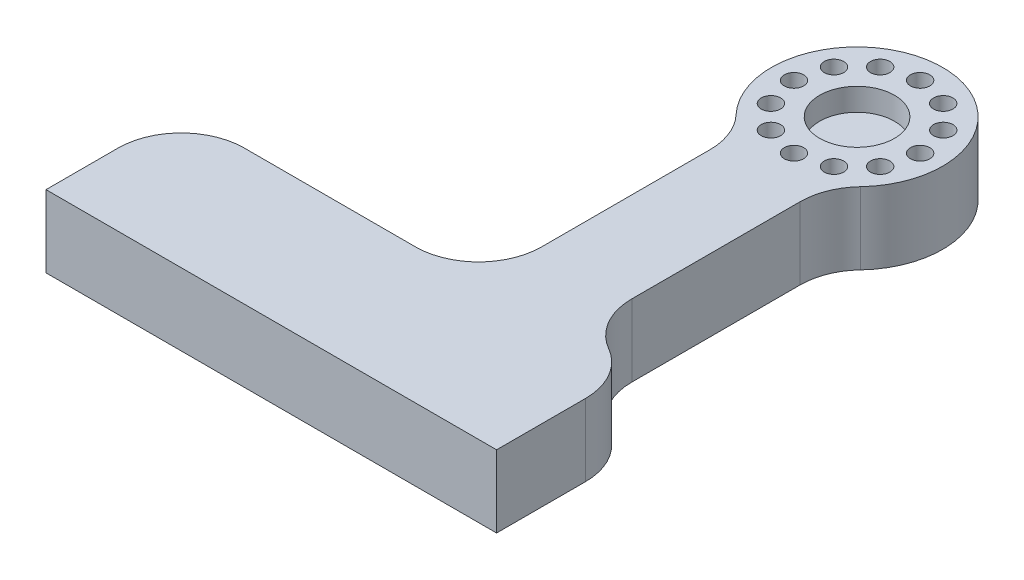
ISO-10303-21;
HEADER;
FILE_DESCRIPTION(('STEP AP214'),'2;1');
FILE_NAME('part.step','',(''),(''),'','','');
FILE_SCHEMA(('AUTOMOTIVE_DESIGN { 1 0 10303 214 1 1 1 1 }'));
ENDSEC;
DATA;
#1=APPLICATION_CONTEXT('core data for automotive mechanical design processes');
#2=APPLICATION_PROTOCOL_DEFINITION('international standard','automotive_design',2000,#1);
#3=PRODUCT_CONTEXT('',#1,'mechanical');
#4=PRODUCT('Part','Part','',(#3));
#5=PRODUCT_RELATED_PRODUCT_CATEGORY('part','',(#4));
#6=PRODUCT_DEFINITION_FORMATION('','',#4);
#7=PRODUCT_DEFINITION_CONTEXT('part definition',#1,'design');
#8=PRODUCT_DEFINITION('design','',#6,#7);
#9=PRODUCT_DEFINITION_SHAPE('','',#8);
#10=(LENGTH_UNIT() NAMED_UNIT(*) SI_UNIT(.MILLI.,.METRE.));
#11=(NAMED_UNIT(*) PLANE_ANGLE_UNIT() SI_UNIT($,.RADIAN.));
#12=(NAMED_UNIT(*) SI_UNIT($,.STERADIAN.) SOLID_ANGLE_UNIT());
#13=UNCERTAINTY_MEASURE_WITH_UNIT(LENGTH_MEASURE(1.E-05),#10,'distance_accuracy_value','');
#14=(GEOMETRIC_REPRESENTATION_CONTEXT(3) GLOBAL_UNCERTAINTY_ASSIGNED_CONTEXT((#13)) GLOBAL_UNIT_ASSIGNED_CONTEXT((#10,
#11,#12)) REPRESENTATION_CONTEXT('',''));
#15=CARTESIAN_POINT('',(0.,0.,0.));
#16=DIRECTION('',(0.,0.,1.));
#17=DIRECTION('',(1.,0.,0.));
#18=AXIS2_PLACEMENT_3D('',#15,#16,#17);
#19=CARTESIAN_POINT('',(5.,8.,0.));
#20=DIRECTION('',(1.,0.,0.));
#21=DIRECTION('',(0.,0.,-1.));
#22=AXIS2_PLACEMENT_3D('',#19,#20,#21);
#23=PLANE('',#22);
#24=DIRECTION('',(0.,0.,1.));
#25=VECTOR('',#24,1.);
#26=CARTESIAN_POINT('',(5.,0.,0.));
#27=LINE('',#26,#25);
#28=CARTESIAN_POINT('',(5.,0.,11.3247516529061));
#29=VERTEX_POINT('',#28);
#30=CARTESIAN_POINT('',(5.,0.,30.));
#31=VERTEX_POINT('',#30);
#32=EDGE_CURVE('E204',#29,#31,#27,.T.);
#33=ORIENTED_EDGE('',*,*,#32,.F.);
#34=DIRECTION('',(0.,-1.,0.));
#35=VECTOR('',#34,1.);
#36=CARTESIAN_POINT('',(5.,8.,11.3247516529061));
#37=LINE('',#36,#35);
#38=CARTESIAN_POINT('',(5.,8.,11.3247516529061));
#39=VERTEX_POINT('',#38);
#40=EDGE_CURVE('E281',#29,#39,#37,.F.);
#41=ORIENTED_EDGE('',*,*,#40,.T.);
#42=DIRECTION('',(0.,0.,1.));
#43=VECTOR('',#42,1.);
#44=CARTESIAN_POINT('',(5.,8.,0.));
#45=LINE('',#44,#43);
#46=CARTESIAN_POINT('',(5.,8.,30.));
#47=VERTEX_POINT('',#46);
#48=EDGE_CURVE('E331',#39,#47,#45,.T.);
#49=ORIENTED_EDGE('',*,*,#48,.T.);
#50=DIRECTION('',(0.,-1.,0.));
#51=VECTOR('',#50,1.);
#52=CARTESIAN_POINT('',(5.,0.,30.));
#53=LINE('',#52,#51);
#54=EDGE_CURVE('E146',#47,#31,#53,.T.);
#55=ORIENTED_EDGE('',*,*,#54,.T.);
#56=EDGE_LOOP('',(#33,#41,#49,#55));
#57=FACE_BOUND('',#56,.T.);
#58=ADVANCED_FACE('F42',(#57),#23,.T.);
#59=CARTESIAN_POINT('',(0.,8.,0.));
#60=DIRECTION('',(0.,-1.,0.));
#61=DIRECTION('',(0.,0.,-1.));
#62=AXIS2_PLACEMENT_3D('',#59,#60,#61);
#63=CYLINDRICAL_SURFACE('',#62,9.5);
#64=CARTESIAN_POINT('',(0.,0.,0.));
#65=DIRECTION('',(0.,1.,0.));
#66=DIRECTION('',(0.,0.,1.));
#67=AXIS2_PLACEMENT_3D('',#64,#65,#66);
#68=CIRCLE('',#67,9.5);
#69=CARTESIAN_POINT('',(6.90909090909091,0.,6.52031155773383));
#70=VERTEX_POINT('',#69);
#71=CARTESIAN_POINT('',(-6.90909090909091,0.,6.52031155773383));
#72=VERTEX_POINT('',#71);
#73=EDGE_CURVE('E207',#70,#72,#68,.T.);
#74=ORIENTED_EDGE('',*,*,#73,.T.);
#75=DIRECTION('',(0.,-1.,0.));
#76=VECTOR('',#75,1.);
#77=CARTESIAN_POINT('',(-6.90909090909091,8.,6.52031155773383));
#78=LINE('',#77,#76);
#79=CARTESIAN_POINT('',(-6.90909090909091,8.,6.52031155773383));
#80=VERTEX_POINT('',#79);
#81=EDGE_CURVE('E279',#72,#80,#78,.F.);
#82=ORIENTED_EDGE('',*,*,#81,.T.);
#83=CARTESIAN_POINT('',(0.,8.,0.));
#84=DIRECTION('',(0.,1.,0.));
#85=DIRECTION('',(0.,0.,1.));
#86=AXIS2_PLACEMENT_3D('',#83,#84,#85);
#87=CIRCLE('',#86,9.5);
#88=CARTESIAN_POINT('',(6.90909090909091,8.,6.52031155773383));
#89=VERTEX_POINT('',#88);
#90=EDGE_CURVE('E329',#89,#80,#87,.T.);
#91=ORIENTED_EDGE('',*,*,#90,.F.);
#92=DIRECTION('',(0.,-1.,0.));
#93=VECTOR('',#92,1.);
#94=CARTESIAN_POINT('',(6.90909090909091,8.,6.52031155773383));
#95=LINE('',#94,#93);
#96=EDGE_CURVE('E276',#89,#70,#95,.T.);
#97=ORIENTED_EDGE('',*,*,#96,.T.);
#98=EDGE_LOOP('',(#74,#82,#91,#97));
#99=FACE_BOUND('',#98,.T.);
#100=ADVANCED_FACE('F333',(#99),#63,.T.);
#101=CARTESIAN_POINT('',(-5.,8.,0.));
#102=DIRECTION('',(-1.,0.,0.));
#103=DIRECTION('',(0.,0.,1.));
#104=AXIS2_PLACEMENT_3D('',#101,#102,#103);
#105=PLANE('',#104);
#106=DIRECTION('',(0.,0.,-1.));
#107=VECTOR('',#106,1.);
#108=CARTESIAN_POINT('',(-5.,8.,0.));
#109=LINE('',#108,#107);
#110=CARTESIAN_POINT('',(-5.,8.,30.));
#111=VERTEX_POINT('',#110);
#112=CARTESIAN_POINT('',(-5.,8.,11.3247516529061));
#113=VERTEX_POINT('',#112);
#114=EDGE_CURVE('E163',#111,#113,#109,.T.);
#115=ORIENTED_EDGE('',*,*,#114,.T.);
#116=DIRECTION('',(0.,-1.,0.));
#117=VECTOR('',#116,1.);
#118=CARTESIAN_POINT('',(-5.,8.,11.3247516529061));
#119=LINE('',#118,#117);
#120=CARTESIAN_POINT('',(-5.,0.,11.3247516529061));
#121=VERTEX_POINT('',#120);
#122=EDGE_CURVE('E273',#113,#121,#119,.T.);
#123=ORIENTED_EDGE('',*,*,#122,.T.);
#124=DIRECTION('',(0.,0.,-1.));
#125=VECTOR('',#124,1.);
#126=CARTESIAN_POINT('',(-5.,0.,0.));
#127=LINE('',#126,#125);
#128=CARTESIAN_POINT('',(-5.,0.,30.));
#129=VERTEX_POINT('',#128);
#130=EDGE_CURVE('E210',#129,#121,#127,.T.);
#131=ORIENTED_EDGE('',*,*,#130,.F.);
#132=DIRECTION('',(0.,-1.,0.));
#133=VECTOR('',#132,1.);
#134=CARTESIAN_POINT('',(-5.,8.,30.));
#135=LINE('',#134,#133);
#136=EDGE_CURVE('E266',#129,#111,#135,.F.);
#137=ORIENTED_EDGE('',*,*,#136,.T.);
#138=EDGE_LOOP('',(#115,#123,#131,#137));
#139=FACE_BOUND('',#138,.T.);
#140=ADVANCED_FACE('F378',(#139),#105,.T.);
#141=CARTESIAN_POINT('',(0.,8.,37.));
#142=DIRECTION('',(0.,0.,-1.));
#143=DIRECTION('',(-1.,0.,0.));
#144=AXIS2_PLACEMENT_3D('',#141,#142,#143);
#145=PLANE('',#144);
#146=DIRECTION('',(1.,0.,0.));
#147=VECTOR('',#146,1.);
#148=CARTESIAN_POINT('',(0.,0.,37.));
#149=LINE('',#148,#147);
#150=CARTESIAN_POINT('',(-31.,0.,37.));
#151=VERTEX_POINT('',#150);
#152=CARTESIAN_POINT('',(-12.,0.,37.));
#153=VERTEX_POINT('',#152);
#154=EDGE_CURVE('E213',#151,#153,#149,.T.);
#155=ORIENTED_EDGE('',*,*,#154,.F.);
#156=DIRECTION('',(0.,-1.,0.));
#157=VECTOR('',#156,1.);
#158=CARTESIAN_POINT('',(-31.,8.,37.));
#159=LINE('',#158,#157);
#160=CARTESIAN_POINT('',(-31.,8.,37.));
#161=VERTEX_POINT('',#160);
#162=EDGE_CURVE('E50',#151,#161,#159,.F.);
#163=ORIENTED_EDGE('',*,*,#162,.T.);
#164=DIRECTION('',(1.,0.,0.));
#165=VECTOR('',#164,1.);
#166=CARTESIAN_POINT('',(0.,8.,37.));
#167=LINE('',#166,#165);
#168=CARTESIAN_POINT('',(-12.,8.,37.));
#169=VERTEX_POINT('',#168);
#170=EDGE_CURVE('E161',#161,#169,#167,.T.);
#171=ORIENTED_EDGE('',*,*,#170,.T.);
#172=DIRECTION('',(0.,-1.,0.));
#173=VECTOR('',#172,1.);
#174=CARTESIAN_POINT('',(-12.,0.,37.));
#175=LINE('',#174,#173);
#176=EDGE_CURVE('E263',#169,#153,#175,.T.);
#177=ORIENTED_EDGE('',*,*,#176,.T.);
#178=EDGE_LOOP('',(#155,#163,#171,#177));
#179=FACE_BOUND('',#178,.T.);
#180=ADVANCED_FACE('F425',(#179),#145,.T.);
#181=CARTESIAN_POINT('',(-38.,8.,0.));
#182=DIRECTION('',(-1.,0.,0.));
#183=DIRECTION('',(0.,0.,1.));
#184=AXIS2_PLACEMENT_3D('',#181,#182,#183);
#185=PLANE('',#184);
#186=DIRECTION('',(0.,0.,-1.));
#187=VECTOR('',#186,1.);
#188=CARTESIAN_POINT('',(-38.,8.,0.));
#189=LINE('',#188,#187);
#190=CARTESIAN_POINT('',(-38.,8.,52.));
#191=VERTEX_POINT('',#190);
#192=CARTESIAN_POINT('',(-38.,8.,44.));
#193=VERTEX_POINT('',#192);
#194=EDGE_CURVE('E140',#191,#193,#189,.T.);
#195=ORIENTED_EDGE('',*,*,#194,.T.);
#196=DIRECTION('',(0.,-1.,0.));
#197=VECTOR('',#196,1.);
#198=CARTESIAN_POINT('',(-38.,8.,44.));
#199=LINE('',#198,#197);
#200=CARTESIAN_POINT('',(-38.,0.,44.));
#201=VERTEX_POINT('',#200);
#202=EDGE_CURVE('E300',#193,#201,#199,.T.);
#203=ORIENTED_EDGE('',*,*,#202,.T.);
#204=DIRECTION('',(0.,0.,-1.));
#205=VECTOR('',#204,1.);
#206=CARTESIAN_POINT('',(-38.,0.,0.));
#207=LINE('',#206,#205);
#208=CARTESIAN_POINT('',(-38.,0.,52.));
#209=VERTEX_POINT('',#208);
#210=EDGE_CURVE('E142',#209,#201,#207,.T.);
#211=ORIENTED_EDGE('',*,*,#210,.F.);
#212=DIRECTION('',(0.,-1.,0.));
#213=VECTOR('',#212,1.);
#214=CARTESIAN_POINT('',(-38.,8.,52.));
#215=LINE('',#214,#213);
#216=EDGE_CURVE('E135',#191,#209,#215,.T.);
#217=ORIENTED_EDGE('',*,*,#216,.F.);
#218=EDGE_LOOP('',(#195,#203,#211,#217));
#219=FACE_BOUND('',#218,.T.);
#220=ADVANCED_FACE('F137',(#219),#185,.T.);
#221=CARTESIAN_POINT('',(0.,8.,52.));
#222=DIRECTION('',(0.,0.,-1.));
#223=DIRECTION('',(-1.,0.,0.));
#224=AXIS2_PLACEMENT_3D('',#221,#222,#223);
#225=PLANE('',#224);
#226=DIRECTION('',(1.,0.,0.));
#227=VECTOR('',#226,1.);
#228=CARTESIAN_POINT('',(0.,0.,52.));
#229=LINE('',#228,#227);
#230=CARTESIAN_POINT('',(12.,0.,52.));
#231=VERTEX_POINT('',#230);
#232=EDGE_CURVE('E216',#209,#231,#229,.T.);
#233=ORIENTED_EDGE('',*,*,#232,.T.);
#234=DIRECTION('',(0.,-1.,0.));
#235=VECTOR('',#234,1.);
#236=CARTESIAN_POINT('',(12.,8.,52.));
#237=LINE('',#236,#235);
#238=CARTESIAN_POINT('',(12.,8.,52.));
#239=VERTEX_POINT('',#238);
#240=EDGE_CURVE('E147',#239,#231,#237,.T.);
#241=ORIENTED_EDGE('',*,*,#240,.F.);
#242=DIRECTION('',(1.,0.,0.));
#243=VECTOR('',#242,1.);
#244=CARTESIAN_POINT('',(0.,8.,52.));
#245=LINE('',#244,#243);
#246=EDGE_CURVE('E151',#191,#239,#245,.T.);
#247=ORIENTED_EDGE('',*,*,#246,.F.);
#248=ORIENTED_EDGE('',*,*,#216,.T.);
#249=EDGE_LOOP('',(#233,#241,#247,#248));
#250=FACE_BOUND('',#249,.T.);
#251=ADVANCED_FACE('F152',(#250),#225,.F.);
#252=CARTESIAN_POINT('',(12.,8.,0.));
#253=DIRECTION('',(-1.,0.,0.));
#254=DIRECTION('',(0.,0.,1.));
#255=AXIS2_PLACEMENT_3D('',#252,#253,#254);
#256=PLANE('',#255);
#257=DIRECTION('',(0.,0.,-1.));
#258=VECTOR('',#257,1.);
#259=CARTESIAN_POINT('',(12.,0.,0.));
#260=LINE('',#259,#258);
#261=CARTESIAN_POINT('',(12.,0.,42.1243556529821));
#262=VERTEX_POINT('',#261);
#263=EDGE_CURVE('E218',#231,#262,#260,.T.);
#264=ORIENTED_EDGE('',*,*,#263,.T.);
#265=DIRECTION('',(0.,1.,0.));
#266=VECTOR('',#265,1.);
#267=CARTESIAN_POINT('',(12.,8.,42.1243556529821));
#268=LINE('',#267,#266);
#269=CARTESIAN_POINT('',(12.,8.,42.1243556529821));
#270=VERTEX_POINT('',#269);
#271=EDGE_CURVE('E296',#262,#270,#268,.T.);
#272=ORIENTED_EDGE('',*,*,#271,.T.);
#273=DIRECTION('',(0.,0.,-1.));
#274=VECTOR('',#273,1.);
#275=CARTESIAN_POINT('',(12.,8.,0.));
#276=LINE('',#275,#274);
#277=EDGE_CURVE('E156',#239,#270,#276,.T.);
#278=ORIENTED_EDGE('',*,*,#277,.F.);
#279=ORIENTED_EDGE('',*,*,#240,.T.);
#280=EDGE_LOOP('',(#264,#272,#278,#279));
#281=FACE_BOUND('',#280,.T.);
#282=ADVANCED_FACE('F307',(#281),#256,.F.);
#283=CARTESIAN_POINT('',(3.50000000000004,8.,-6.0621778264912));
#284=DIRECTION('',(0.,-1.,0.));
#285=DIRECTION('',(0.,0.,-1.));
#286=AXIS2_PLACEMENT_3D('',#283,#284,#285);
#287=CYLINDRICAL_SURFACE('',#286,1.075);
#288=CARTESIAN_POINT('',(3.50000000000004,8.,-6.0621778264912));
#289=DIRECTION('',(0.,1.,0.));
#290=DIRECTION('',(0.,0.,1.));
#291=AXIS2_PLACEMENT_3D('',#288,#289,#290);
#292=CIRCLE('',#291,1.075);
#293=CARTESIAN_POINT('',(3.50000000000004,8.,-4.9871778264912));
#294=VERTEX_POINT('',#293);
#295=EDGE_CURVE('E195',#294,#294,#292,.T.);
#296=ORIENTED_EDGE('',*,*,#295,.T.);
#297=EDGE_LOOP('',(#296));
#298=FACE_BOUND('',#297,.T.);
#299=CARTESIAN_POINT('',(3.50000000000004,0.,-6.0621778264912));
#300=DIRECTION('',(0.,1.,0.));
#301=DIRECTION('',(0.,0.,1.));
#302=AXIS2_PLACEMENT_3D('',#299,#300,#301);
#303=CIRCLE('',#302,1.075);
#304=CARTESIAN_POINT('',(3.50000000000004,0.,-4.9871778264912));
#305=VERTEX_POINT('',#304);
#306=EDGE_CURVE('E248',#305,#305,#303,.T.);
#307=ORIENTED_EDGE('',*,*,#306,.F.);
#308=EDGE_LOOP('',(#307));
#309=FACE_BOUND('',#308,.T.);
#310=ADVANCED_FACE('F463',(#298,#309),#287,.F.);
#311=CARTESIAN_POINT('',(6.0621778264912,8.,-3.50000000000022));
#312=DIRECTION('',(0.,-1.,0.));
#313=DIRECTION('',(0.,0.,-1.));
#314=AXIS2_PLACEMENT_3D('',#311,#312,#313);
#315=CYLINDRICAL_SURFACE('',#314,1.075);
#316=CARTESIAN_POINT('',(6.0621778264912,8.,-3.50000000000022));
#317=DIRECTION('',(0.,1.,0.));
#318=DIRECTION('',(0.,0.,1.));
#319=AXIS2_PLACEMENT_3D('',#316,#317,#318);
#320=CIRCLE('',#319,1.075);
#321=CARTESIAN_POINT('',(6.0621778264912,8.,-2.42500000000022));
#322=VERTEX_POINT('',#321);
#323=EDGE_CURVE('E192',#322,#322,#320,.T.);
#324=ORIENTED_EDGE('',*,*,#323,.T.);
#325=EDGE_LOOP('',(#324));
#326=FACE_BOUND('',#325,.T.);
#327=CARTESIAN_POINT('',(6.0621778264912,0.,-3.50000000000022));
#328=DIRECTION('',(0.,1.,0.));
#329=DIRECTION('',(0.,0.,1.));
#330=AXIS2_PLACEMENT_3D('',#327,#328,#329);
#331=CIRCLE('',#330,1.075);
#332=CARTESIAN_POINT('',(6.0621778264912,0.,-2.42500000000022));
#333=VERTEX_POINT('',#332);
#334=EDGE_CURVE('E245',#333,#333,#331,.T.);
#335=ORIENTED_EDGE('',*,*,#334,.F.);
#336=EDGE_LOOP('',(#335));
#337=FACE_BOUND('',#336,.T.);
#338=ADVANCED_FACE('F619',(#326,#337),#315,.F.);
#339=CARTESIAN_POINT('',(7.00000000000025,8.,-2.54754435094361E-13));
#340=DIRECTION('',(0.,-1.,0.));
#341=DIRECTION('',(0.,0.,-1.));
#342=AXIS2_PLACEMENT_3D('',#339,#340,#341);
#343=CYLINDRICAL_SURFACE('',#342,1.075);
#344=CARTESIAN_POINT('',(7.00000000000025,8.,-2.54754435094361E-13));
#345=DIRECTION('',(0.,1.,0.));
#346=DIRECTION('',(0.,0.,1.));
#347=AXIS2_PLACEMENT_3D('',#344,#345,#346);
#348=CIRCLE('',#347,1.075);
#349=CARTESIAN_POINT('',(7.00000000000025,8.,1.07499999999974));
#350=VERTEX_POINT('',#349);
#351=EDGE_CURVE('E189',#350,#350,#348,.T.);
#352=ORIENTED_EDGE('',*,*,#351,.T.);
#353=EDGE_LOOP('',(#352));
#354=FACE_BOUND('',#353,.T.);
#355=CARTESIAN_POINT('',(7.00000000000025,0.,-2.54754435094361E-13));
#356=DIRECTION('',(0.,1.,0.));
#357=DIRECTION('',(0.,0.,1.));
#358=AXIS2_PLACEMENT_3D('',#355,#356,#357);
#359=CIRCLE('',#358,1.075);
#360=CARTESIAN_POINT('',(7.00000000000025,0.,1.07499999999974));
#361=VERTEX_POINT('',#360);
#362=EDGE_CURVE('E242',#361,#361,#359,.T.);
#363=ORIENTED_EDGE('',*,*,#362,.F.);
#364=EDGE_LOOP('',(#363));
#365=FACE_BOUND('',#364,.T.);
#366=ADVANCED_FACE('F608',(#354,#365),#343,.F.);
#367=CARTESIAN_POINT('',(-6.99999999999975,8.,2.55611687853764E-13));
#368=DIRECTION('',(0.,-1.,0.));
#369=DIRECTION('',(0.,0.,-1.));
#370=AXIS2_PLACEMENT_3D('',#367,#368,#369);
#371=CYLINDRICAL_SURFACE('',#370,1.075);
#372=CARTESIAN_POINT('',(-6.99999999999975,8.,2.55611687853764E-13));
#373=DIRECTION('',(0.,1.,0.));
#374=DIRECTION('',(0.,0.,1.));
#375=AXIS2_PLACEMENT_3D('',#372,#373,#374);
#376=CIRCLE('',#375,1.075);
#377=CARTESIAN_POINT('',(-6.99999999999975,8.,1.07500000000026));
#378=VERTEX_POINT('',#377);
#379=EDGE_CURVE('E186',#378,#378,#376,.T.);
#380=ORIENTED_EDGE('',*,*,#379,.T.);
#381=EDGE_LOOP('',(#380));
#382=FACE_BOUND('',#381,.T.);
#383=CARTESIAN_POINT('',(-6.99999999999975,0.,2.55611687853764E-13));
#384=DIRECTION('',(0.,1.,0.));
#385=DIRECTION('',(0.,0.,1.));
#386=AXIS2_PLACEMENT_3D('',#383,#384,#385);
#387=CIRCLE('',#386,1.075);
#388=CARTESIAN_POINT('',(-6.99999999999975,0.,1.07500000000026));
#389=VERTEX_POINT('',#388);
#390=EDGE_CURVE('E239',#389,#389,#387,.T.);
#391=ORIENTED_EDGE('',*,*,#390,.F.);
#392=EDGE_LOOP('',(#391));
#393=FACE_BOUND('',#392,.T.);
#394=ADVANCED_FACE('F597',(#382,#393),#371,.F.);
#395=CARTESIAN_POINT('',(-6.06217782649095,8.,-3.49999999999978));
#396=DIRECTION('',(0.,-1.,0.));
#397=DIRECTION('',(0.,0.,-1.));
#398=AXIS2_PLACEMENT_3D('',#395,#396,#397);
#399=CYLINDRICAL_SURFACE('',#398,1.075);
#400=CARTESIAN_POINT('',(-6.06217782649095,8.,-3.49999999999978));
#401=DIRECTION('',(0.,1.,0.));
#402=DIRECTION('',(0.,0.,1.));
#403=AXIS2_PLACEMENT_3D('',#400,#401,#402);
#404=CIRCLE('',#403,1.075);
#405=CARTESIAN_POINT('',(-6.06217782649095,8.,-2.42499999999977));
#406=VERTEX_POINT('',#405);
#407=EDGE_CURVE('E183',#406,#406,#404,.T.);
#408=ORIENTED_EDGE('',*,*,#407,.T.);
#409=EDGE_LOOP('',(#408));
#410=FACE_BOUND('',#409,.T.);
#411=CARTESIAN_POINT('',(-6.06217782649095,0.,-3.49999999999978));
#412=DIRECTION('',(0.,1.,0.));
#413=DIRECTION('',(0.,0.,1.));
#414=AXIS2_PLACEMENT_3D('',#411,#412,#413);
#415=CIRCLE('',#414,1.075);
#416=CARTESIAN_POINT('',(-6.06217782649095,0.,-2.42499999999977));
#417=VERTEX_POINT('',#416);
#418=EDGE_CURVE('E236',#417,#417,#415,.T.);
#419=ORIENTED_EDGE('',*,*,#418,.F.);
#420=EDGE_LOOP('',(#419));
#421=FACE_BOUND('',#420,.T.);
#422=ADVANCED_FACE('F586',(#410,#421),#399,.F.);
#423=CARTESIAN_POINT('',(-3.49999999999997,8.,-6.06217782649094));
#424=DIRECTION('',(0.,-1.,0.));
#425=DIRECTION('',(0.,0.,-1.));
#426=AXIS2_PLACEMENT_3D('',#423,#424,#425);
#427=CYLINDRICAL_SURFACE('',#426,1.075);
#428=CARTESIAN_POINT('',(-3.49999999999997,8.,-6.06217782649094));
#429=DIRECTION('',(0.,1.,0.));
#430=DIRECTION('',(0.,0.,1.));
#431=AXIS2_PLACEMENT_3D('',#428,#429,#430);
#432=CIRCLE('',#431,1.075);
#433=CARTESIAN_POINT('',(-3.49999999999997,8.,-4.98717782649094));
#434=VERTEX_POINT('',#433);
#435=EDGE_CURVE('E180',#434,#434,#432,.T.);
#436=ORIENTED_EDGE('',*,*,#435,.T.);
#437=EDGE_LOOP('',(#436));
#438=FACE_BOUND('',#437,.T.);
#439=CARTESIAN_POINT('',(-3.49999999999997,0.,-6.06217782649094));
#440=DIRECTION('',(0.,1.,0.));
#441=DIRECTION('',(0.,0.,1.));
#442=AXIS2_PLACEMENT_3D('',#439,#440,#441);
#443=CIRCLE('',#442,1.075);
#444=CARTESIAN_POINT('',(-3.49999999999997,0.,-4.98717782649094));
#445=VERTEX_POINT('',#444);
#446=EDGE_CURVE('E233',#445,#445,#443,.T.);
#447=ORIENTED_EDGE('',*,*,#446,.F.);
#448=EDGE_LOOP('',(#447));
#449=FACE_BOUND('',#448,.T.);
#450=ADVANCED_FACE('F575',(#438,#449),#427,.F.);
#451=CARTESIAN_POINT('',(3.50000000000048,8.,6.06217782649094));
#452=DIRECTION('',(0.,-1.,0.));
#453=DIRECTION('',(0.,0.,-1.));
#454=AXIS2_PLACEMENT_3D('',#451,#452,#453);
#455=CYLINDRICAL_SURFACE('',#454,1.075);
#456=CARTESIAN_POINT('',(3.50000000000048,8.,6.06217782649094));
#457=DIRECTION('',(0.,1.,0.));
#458=DIRECTION('',(0.,0.,1.));
#459=AXIS2_PLACEMENT_3D('',#456,#457,#458);
#460=CIRCLE('',#459,1.075);
#461=CARTESIAN_POINT('',(3.50000000000048,8.,7.13717782649094));
#462=VERTEX_POINT('',#461);
#463=EDGE_CURVE('E177',#462,#462,#460,.T.);
#464=ORIENTED_EDGE('',*,*,#463,.T.);
#465=EDGE_LOOP('',(#464));
#466=FACE_BOUND('',#465,.T.);
#467=CARTESIAN_POINT('',(3.50000000000048,0.,6.06217782649094));
#468=DIRECTION('',(0.,1.,0.));
#469=DIRECTION('',(0.,0.,1.));
#470=AXIS2_PLACEMENT_3D('',#467,#468,#469);
#471=CIRCLE('',#470,1.075);
#472=CARTESIAN_POINT('',(3.50000000000048,0.,7.13717782649094));
#473=VERTEX_POINT('',#472);
#474=EDGE_CURVE('E230',#473,#473,#471,.T.);
#475=ORIENTED_EDGE('',*,*,#474,.F.);
#476=EDGE_LOOP('',(#475));
#477=FACE_BOUND('',#476,.T.);
#478=ADVANCED_FACE('F564',(#466,#477),#455,.F.);
#479=CARTESIAN_POINT('',(5.09508870188722E-13,8.,7.));
#480=DIRECTION('',(0.,-1.,0.));
#481=DIRECTION('',(0.,0.,-1.));
#482=AXIS2_PLACEMENT_3D('',#479,#480,#481);
#483=CYLINDRICAL_SURFACE('',#482,1.075);
#484=CARTESIAN_POINT('',(5.09508870188722E-13,8.,7.));
#485=DIRECTION('',(0.,1.,0.));
#486=DIRECTION('',(0.,0.,1.));
#487=AXIS2_PLACEMENT_3D('',#484,#485,#486);
#488=CIRCLE('',#487,1.075);
#489=CARTESIAN_POINT('',(5.09508870188722E-13,8.,8.075));
#490=VERTEX_POINT('',#489);
#491=EDGE_CURVE('E174',#490,#490,#488,.T.);
#492=ORIENTED_EDGE('',*,*,#491,.T.);
#493=EDGE_LOOP('',(#492));
#494=FACE_BOUND('',#493,.T.);
#495=CARTESIAN_POINT('',(5.09508870188722E-13,0.,7.));
#496=DIRECTION('',(0.,1.,0.));
#497=DIRECTION('',(0.,0.,1.));
#498=AXIS2_PLACEMENT_3D('',#495,#496,#497);
#499=CIRCLE('',#498,1.075);
#500=CARTESIAN_POINT('',(5.09508870188722E-13,0.,8.075));
#501=VERTEX_POINT('',#500);
#502=EDGE_CURVE('E227',#501,#501,#499,.T.);
#503=ORIENTED_EDGE('',*,*,#502,.F.);
#504=EDGE_LOOP('',(#503));
#505=FACE_BOUND('',#504,.T.);
#506=ADVANCED_FACE('F553',(#494,#505),#483,.F.);
#507=CARTESIAN_POINT('',(-3.49999999999952,8.,6.0621778264912));
#508=DIRECTION('',(0.,-1.,0.));
#509=DIRECTION('',(0.,0.,-1.));
#510=AXIS2_PLACEMENT_3D('',#507,#508,#509);
#511=CYLINDRICAL_SURFACE('',#510,1.075);
#512=CARTESIAN_POINT('',(-3.49999999999952,8.,6.0621778264912));
#513=DIRECTION('',(0.,1.,0.));
#514=DIRECTION('',(0.,0.,1.));
#515=AXIS2_PLACEMENT_3D('',#512,#513,#514);
#516=CIRCLE('',#515,1.075);
#517=CARTESIAN_POINT('',(-3.49999999999952,8.,7.1371778264912));
#518=VERTEX_POINT('',#517);
#519=EDGE_CURVE('E171',#518,#518,#516,.T.);
#520=ORIENTED_EDGE('',*,*,#519,.T.);
#521=EDGE_LOOP('',(#520));
#522=FACE_BOUND('',#521,.T.);
#523=CARTESIAN_POINT('',(-3.49999999999952,0.,6.0621778264912));
#524=DIRECTION('',(0.,1.,0.));
#525=DIRECTION('',(0.,0.,1.));
#526=AXIS2_PLACEMENT_3D('',#523,#524,#525);
#527=CIRCLE('',#526,1.075);
#528=CARTESIAN_POINT('',(-3.49999999999952,0.,7.1371778264912));
#529=VERTEX_POINT('',#528);
#530=EDGE_CURVE('E224',#529,#529,#527,.T.);
#531=ORIENTED_EDGE('',*,*,#530,.F.);
#532=EDGE_LOOP('',(#531));
#533=FACE_BOUND('',#532,.T.);
#534=ADVANCED_FACE('F542',(#522,#533),#511,.F.);
#535=CARTESIAN_POINT('',(6.06217782649145,8.,3.49999999999978));
#536=DIRECTION('',(0.,-1.,0.));
#537=DIRECTION('',(0.,0.,-1.));
#538=AXIS2_PLACEMENT_3D('',#535,#536,#537);
#539=CYLINDRICAL_SURFACE('',#538,1.075);
#540=CARTESIAN_POINT('',(6.06217782649145,8.,3.49999999999978));
#541=DIRECTION('',(0.,1.,0.));
#542=DIRECTION('',(0.,0.,1.));
#543=AXIS2_PLACEMENT_3D('',#540,#541,#542);
#544=CIRCLE('',#543,1.075);
#545=CARTESIAN_POINT('',(6.06217782649145,8.,4.57499999999978));
#546=VERTEX_POINT('',#545);
#547=EDGE_CURVE('E168',#546,#546,#544,.T.);
#548=ORIENTED_EDGE('',*,*,#547,.T.);
#549=EDGE_LOOP('',(#548));
#550=FACE_BOUND('',#549,.T.);
#551=CARTESIAN_POINT('',(6.06217782649145,0.,3.49999999999978));
#552=DIRECTION('',(0.,1.,0.));
#553=DIRECTION('',(0.,0.,1.));
#554=AXIS2_PLACEMENT_3D('',#551,#552,#553);
#555=CIRCLE('',#554,1.075);
#556=CARTESIAN_POINT('',(6.06217782649145,0.,4.57499999999978));
#557=VERTEX_POINT('',#556);
#558=EDGE_CURVE('E221',#557,#557,#555,.T.);
#559=ORIENTED_EDGE('',*,*,#558,.F.);
#560=EDGE_LOOP('',(#559));
#561=FACE_BOUND('',#560,.T.);
#562=ADVANCED_FACE('F364',(#550,#561),#539,.F.);
#563=CARTESIAN_POINT('',(-6.06217782649069,8.,3.50000000000022));
#564=DIRECTION('',(0.,-1.,0.));
#565=DIRECTION('',(0.,0.,-1.));
#566=AXIS2_PLACEMENT_3D('',#563,#564,#565);
#567=CYLINDRICAL_SURFACE('',#566,1.075);
#568=CARTESIAN_POINT('',(-6.06217782649069,8.,3.50000000000022));
#569=DIRECTION('',(0.,1.,0.));
#570=DIRECTION('',(0.,0.,1.));
#571=AXIS2_PLACEMENT_3D('',#568,#569,#570);
#572=CIRCLE('',#571,1.075);
#573=CARTESIAN_POINT('',(-6.06217782649069,8.,4.57500000000022));
#574=VERTEX_POINT('',#573);
#575=EDGE_CURVE('E254',#574,#574,#572,.T.);
#576=ORIENTED_EDGE('',*,*,#575,.T.);
#577=EDGE_LOOP('',(#576));
#578=FACE_BOUND('',#577,.T.);
#579=CARTESIAN_POINT('',(-6.06217782649069,0.,3.50000000000022));
#580=DIRECTION('',(0.,1.,0.));
#581=DIRECTION('',(0.,0.,1.));
#582=AXIS2_PLACEMENT_3D('',#579,#580,#581);
#583=CIRCLE('',#582,1.075);
#584=CARTESIAN_POINT('',(-6.06217782649069,0.,4.57500000000022));
#585=VERTEX_POINT('',#584);
#586=EDGE_CURVE('E201',#585,#585,#583,.T.);
#587=ORIENTED_EDGE('',*,*,#586,.F.);
#588=EDGE_LOOP('',(#587));
#589=FACE_BOUND('',#588,.T.);
#590=ADVANCED_FACE('F361',(#578,#589),#567,.F.);
#591=CARTESIAN_POINT('',(0.,8.,-7.));
#592=DIRECTION('',(0.,-1.,0.));
#593=DIRECTION('',(0.,0.,-1.));
#594=AXIS2_PLACEMENT_3D('',#591,#592,#593);
#595=CYLINDRICAL_SURFACE('',#594,1.075);
#596=CARTESIAN_POINT('',(0.,8.,-7.));
#597=DIRECTION('',(0.,1.,0.));
#598=DIRECTION('',(0.,0.,1.));
#599=AXIS2_PLACEMENT_3D('',#596,#597,#598);
#600=CIRCLE('',#599,1.075);
#601=CARTESIAN_POINT('',(0.,8.,-5.925));
#602=VERTEX_POINT('',#601);
#603=EDGE_CURVE('E198',#602,#602,#600,.T.);
#604=ORIENTED_EDGE('',*,*,#603,.T.);
#605=EDGE_LOOP('',(#604));
#606=FACE_BOUND('',#605,.T.);
#607=CARTESIAN_POINT('',(0.,0.,-7.));
#608=DIRECTION('',(0.,1.,0.));
#609=DIRECTION('',(0.,0.,1.));
#610=AXIS2_PLACEMENT_3D('',#607,#608,#609);
#611=CIRCLE('',#610,1.075);
#612=CARTESIAN_POINT('',(0.,0.,-5.925));
#613=VERTEX_POINT('',#612);
#614=EDGE_CURVE('E251',#613,#613,#611,.T.);
#615=ORIENTED_EDGE('',*,*,#614,.F.);
#616=EDGE_LOOP('',(#615));
#617=FACE_BOUND('',#616,.T.);
#618=ADVANCED_FACE('F357',(#606,#617),#595,.F.);
#619=CARTESIAN_POINT('',(0.,8.,0.));
#620=DIRECTION('',(0.,1.,0.));
#621=DIRECTION('',(0.,0.,1.));
#622=AXIS2_PLACEMENT_3D('',#619,#620,#621);
#623=PLANE('',#622);
#624=CARTESIAN_POINT('',(0.,8.,0.));
#625=DIRECTION('',(0.,1.,0.));
#626=DIRECTION('',(0.,0.,1.));
#627=AXIS2_PLACEMENT_3D('',#624,#625,#626);
#628=CIRCLE('',#627,4.15);
#629=CARTESIAN_POINT('',(0.,8.,4.15));
#630=VERTEX_POINT('',#629);
#631=EDGE_CURVE('E341',#630,#630,#628,.T.);
#632=ORIENTED_EDGE('',*,*,#631,.F.);
#633=EDGE_LOOP('',(#632));
#634=FACE_BOUND('',#633,.T.);
#635=ORIENTED_EDGE('',*,*,#575,.F.);
#636=EDGE_LOOP('',(#635));
#637=FACE_BOUND('',#636,.T.);
#638=ORIENTED_EDGE('',*,*,#170,.F.);
#639=CARTESIAN_POINT('',(-31.,8.,44.));
#640=DIRECTION('',(0.,1.,0.));
#641=DIRECTION('',(0.,0.,1.));
#642=AXIS2_PLACEMENT_3D('',#639,#640,#641);
#643=CIRCLE('',#642,7.);
#644=EDGE_CURVE('E11',#161,#193,#643,.T.);
#645=ORIENTED_EDGE('',*,*,#644,.T.);
#646=ORIENTED_EDGE('',*,*,#194,.F.);
#647=ORIENTED_EDGE('',*,*,#246,.T.);
#648=ORIENTED_EDGE('',*,*,#277,.T.);
#649=CARTESIAN_POINT('',(5.00000000000001,8.,42.1243556529821));
#650=DIRECTION('',(0.,1.,0.));
#651=DIRECTION('',(0.,0.,1.));
#652=AXIS2_PLACEMENT_3D('',#649,#650,#651);
#653=CIRCLE('',#652,7.);
#654=CARTESIAN_POINT('',(8.5,8.,36.0621778264911));
#655=VERTEX_POINT('',#654);
#656=EDGE_CURVE('E298',#270,#655,#653,.T.);
#657=ORIENTED_EDGE('',*,*,#656,.T.);
#658=CARTESIAN_POINT('',(12.,8.,30.));
#659=DIRECTION('',(0.,1.,0.));
#660=DIRECTION('',(0.,0.,1.));
#661=AXIS2_PLACEMENT_3D('',#658,#659,#660);
#662=CIRCLE('',#661,7.);
#663=EDGE_CURVE('E261',#655,#47,#662,.F.);
#664=ORIENTED_EDGE('',*,*,#663,.T.);
#665=ORIENTED_EDGE('',*,*,#48,.F.);
#666=CARTESIAN_POINT('',(12.,8.,11.3247516529061));
#667=DIRECTION('',(0.,1.,0.));
#668=DIRECTION('',(0.,0.,1.));
#669=AXIS2_PLACEMENT_3D('',#666,#667,#668);
#670=CIRCLE('',#669,7.);
#671=EDGE_CURVE('E289',#39,#89,#670,.F.);
#672=ORIENTED_EDGE('',*,*,#671,.T.);
#673=ORIENTED_EDGE('',*,*,#90,.T.);
#674=CARTESIAN_POINT('',(-12.,8.,11.3247516529061));
#675=DIRECTION('',(0.,1.,0.));
#676=DIRECTION('',(0.,0.,1.));
#677=AXIS2_PLACEMENT_3D('',#674,#675,#676);
#678=CIRCLE('',#677,7.);
#679=EDGE_CURVE('E285',#80,#113,#678,.F.);
#680=ORIENTED_EDGE('',*,*,#679,.T.);
#681=ORIENTED_EDGE('',*,*,#114,.F.);
#682=CARTESIAN_POINT('',(-12.,8.,30.));
#683=DIRECTION('',(0.,1.,0.));
#684=DIRECTION('',(0.,0.,1.));
#685=AXIS2_PLACEMENT_3D('',#682,#683,#684);
#686=CIRCLE('',#685,7.);
#687=EDGE_CURVE('E270',#111,#169,#686,.F.);
#688=ORIENTED_EDGE('',*,*,#687,.T.);
#689=EDGE_LOOP('',(#638,#645,#646,#647,#648,#657,#664,#665,#672,#673,#680,#681,#688));
#690=FACE_BOUND('',#689,.T.);
#691=ORIENTED_EDGE('',*,*,#547,.F.);
#692=EDGE_LOOP('',(#691));
#693=FACE_BOUND('',#692,.T.);
#694=ORIENTED_EDGE('',*,*,#519,.F.);
#695=EDGE_LOOP('',(#694));
#696=FACE_BOUND('',#695,.T.);
#697=ORIENTED_EDGE('',*,*,#491,.F.);
#698=EDGE_LOOP('',(#697));
#699=FACE_BOUND('',#698,.T.);
#700=ORIENTED_EDGE('',*,*,#463,.F.);
#701=EDGE_LOOP('',(#700));
#702=FACE_BOUND('',#701,.T.);
#703=ORIENTED_EDGE('',*,*,#435,.F.);
#704=EDGE_LOOP('',(#703));
#705=FACE_BOUND('',#704,.T.);
#706=ORIENTED_EDGE('',*,*,#407,.F.);
#707=EDGE_LOOP('',(#706));
#708=FACE_BOUND('',#707,.T.);
#709=ORIENTED_EDGE('',*,*,#379,.F.);
#710=EDGE_LOOP('',(#709));
#711=FACE_BOUND('',#710,.T.);
#712=ORIENTED_EDGE('',*,*,#351,.F.);
#713=EDGE_LOOP('',(#712));
#714=FACE_BOUND('',#713,.T.);
#715=ORIENTED_EDGE('',*,*,#323,.F.);
#716=EDGE_LOOP('',(#715));
#717=FACE_BOUND('',#716,.T.);
#718=ORIENTED_EDGE('',*,*,#295,.F.);
#719=EDGE_LOOP('',(#718));
#720=FACE_BOUND('',#719,.T.);
#721=ORIENTED_EDGE('',*,*,#603,.F.);
#722=EDGE_LOOP('',(#721));
#723=FACE_BOUND('',#722,.T.);
#724=ADVANCED_FACE('F158',(#634,#637,#690,#693,#696,#699,#702,#705,#708,#711,#714,#717,#720,
#723),#623,.T.);
#725=CARTESIAN_POINT('',(0.,0.,0.));
#726=DIRECTION('',(0.,1.,0.));
#727=DIRECTION('',(0.,0.,1.));
#728=AXIS2_PLACEMENT_3D('',#725,#726,#727);
#729=PLANE('',#728);
#730=ORIENTED_EDGE('',*,*,#586,.T.);
#731=EDGE_LOOP('',(#730));
#732=FACE_BOUND('',#731,.T.);
#733=ORIENTED_EDGE('',*,*,#210,.T.);
#734=CARTESIAN_POINT('',(-31.,0.,44.));
#735=DIRECTION('',(0.,1.,0.));
#736=DIRECTION('',(0.,0.,1.));
#737=AXIS2_PLACEMENT_3D('',#734,#735,#736);
#738=CIRCLE('',#737,7.);
#739=EDGE_CURVE('E64',#201,#151,#738,.F.);
#740=ORIENTED_EDGE('',*,*,#739,.T.);
#741=ORIENTED_EDGE('',*,*,#154,.T.);
#742=CARTESIAN_POINT('',(-12.,0.,30.));
#743=DIRECTION('',(0.,1.,0.));
#744=DIRECTION('',(0.,0.,1.));
#745=AXIS2_PLACEMENT_3D('',#742,#743,#744);
#746=CIRCLE('',#745,7.);
#747=EDGE_CURVE('E268',#153,#129,#746,.T.);
#748=ORIENTED_EDGE('',*,*,#747,.T.);
#749=ORIENTED_EDGE('',*,*,#130,.T.);
#750=CARTESIAN_POINT('',(-12.,0.,11.3247516529061));
#751=DIRECTION('',(0.,1.,0.));
#752=DIRECTION('',(0.,0.,1.));
#753=AXIS2_PLACEMENT_3D('',#750,#751,#752);
#754=CIRCLE('',#753,7.);
#755=EDGE_CURVE('E283',#121,#72,#754,.T.);
#756=ORIENTED_EDGE('',*,*,#755,.T.);
#757=ORIENTED_EDGE('',*,*,#73,.F.);
#758=CARTESIAN_POINT('',(12.,0.,11.3247516529061));
#759=DIRECTION('',(0.,1.,0.));
#760=DIRECTION('',(0.,0.,1.));
#761=AXIS2_PLACEMENT_3D('',#758,#759,#760);
#762=CIRCLE('',#761,7.);
#763=EDGE_CURVE('E287',#70,#29,#762,.T.);
#764=ORIENTED_EDGE('',*,*,#763,.T.);
#765=ORIENTED_EDGE('',*,*,#32,.T.);
#766=CARTESIAN_POINT('',(12.,0.,30.));
#767=DIRECTION('',(0.,1.,0.));
#768=DIRECTION('',(0.,0.,1.));
#769=AXIS2_PLACEMENT_3D('',#766,#767,#768);
#770=CIRCLE('',#769,7.);
#771=CARTESIAN_POINT('',(8.5,0.,36.0621778264911));
#772=VERTEX_POINT('',#771);
#773=EDGE_CURVE('E258',#31,#772,#770,.T.);
#774=ORIENTED_EDGE('',*,*,#773,.T.);
#775=CARTESIAN_POINT('',(5.00000000000001,0.,42.1243556529821));
#776=DIRECTION('',(0.,1.,0.));
#777=DIRECTION('',(0.,0.,1.));
#778=AXIS2_PLACEMENT_3D('',#775,#776,#777);
#779=CIRCLE('',#778,7.);
#780=EDGE_CURVE('E294',#772,#262,#779,.F.);
#781=ORIENTED_EDGE('',*,*,#780,.T.);
#782=ORIENTED_EDGE('',*,*,#263,.F.);
#783=ORIENTED_EDGE('',*,*,#232,.F.);
#784=EDGE_LOOP('',(#733,#740,#741,#748,#749,#756,#757,#764,#765,#774,#781,#782,#783));
#785=FACE_BOUND('',#784,.T.);
#786=ORIENTED_EDGE('',*,*,#558,.T.);
#787=EDGE_LOOP('',(#786));
#788=FACE_BOUND('',#787,.T.);
#789=ORIENTED_EDGE('',*,*,#530,.T.);
#790=EDGE_LOOP('',(#789));
#791=FACE_BOUND('',#790,.T.);
#792=ORIENTED_EDGE('',*,*,#502,.T.);
#793=EDGE_LOOP('',(#792));
#794=FACE_BOUND('',#793,.T.);
#795=ORIENTED_EDGE('',*,*,#474,.T.);
#796=EDGE_LOOP('',(#795));
#797=FACE_BOUND('',#796,.T.);
#798=ORIENTED_EDGE('',*,*,#446,.T.);
#799=EDGE_LOOP('',(#798));
#800=FACE_BOUND('',#799,.T.);
#801=ORIENTED_EDGE('',*,*,#418,.T.);
#802=EDGE_LOOP('',(#801));
#803=FACE_BOUND('',#802,.T.);
#804=ORIENTED_EDGE('',*,*,#390,.T.);
#805=EDGE_LOOP('',(#804));
#806=FACE_BOUND('',#805,.T.);
#807=ORIENTED_EDGE('',*,*,#362,.T.);
#808=EDGE_LOOP('',(#807));
#809=FACE_BOUND('',#808,.T.);
#810=ORIENTED_EDGE('',*,*,#334,.T.);
#811=EDGE_LOOP('',(#810));
#812=FACE_BOUND('',#811,.T.);
#813=ORIENTED_EDGE('',*,*,#306,.T.);
#814=EDGE_LOOP('',(#813));
#815=FACE_BOUND('',#814,.T.);
#816=ORIENTED_EDGE('',*,*,#614,.T.);
#817=EDGE_LOOP('',(#816));
#818=FACE_BOUND('',#817,.T.);
#819=ADVANCED_FACE('F303',(#732,#785,#788,#791,#794,#797,#800,#803,#806,#809,#812,#815,#818),
#729,.F.);
#820=CARTESIAN_POINT('',(0.,5.5,0.));
#821=DIRECTION('',(0.,1.,0.));
#822=DIRECTION('',(0.,0.,1.));
#823=AXIS2_PLACEMENT_3D('',#820,#821,#822);
#824=CYLINDRICAL_SURFACE('',#823,4.15);
#825=CARTESIAN_POINT('',(0.,5.5,0.));
#826=DIRECTION('',(0.,1.,0.));
#827=DIRECTION('',(0.,0.,1.));
#828=AXIS2_PLACEMENT_3D('',#825,#826,#827);
#829=CIRCLE('',#828,4.15);
#830=CARTESIAN_POINT('',(0.,5.5,4.15));
#831=VERTEX_POINT('',#830);
#832=EDGE_CURVE('E205',#831,#831,#829,.T.);
#833=ORIENTED_EDGE('',*,*,#832,.F.);
#834=EDGE_LOOP('',(#833));
#835=FACE_BOUND('',#834,.T.);
#836=ORIENTED_EDGE('',*,*,#631,.T.);
#837=EDGE_LOOP('',(#836));
#838=FACE_BOUND('',#837,.T.);
#839=ADVANCED_FACE('F349',(#835,#838),#824,.F.);
#840=CARTESIAN_POINT('',(0.,5.5,0.));
#841=DIRECTION('',(0.,1.,0.));
#842=DIRECTION('',(0.,0.,1.));
#843=AXIS2_PLACEMENT_3D('',#840,#841,#842);
#844=PLANE('',#843);
#845=ORIENTED_EDGE('',*,*,#832,.T.);
#846=EDGE_LOOP('',(#845));
#847=FACE_BOUND('',#846,.T.);
#848=ADVANCED_FACE('F347',(#847),#844,.T.);
#849=CARTESIAN_POINT('',(12.,8.,30.));
#850=DIRECTION('',(0.,1.,0.));
#851=DIRECTION('',(0.,0.,1.));
#852=AXIS2_PLACEMENT_3D('',#849,#850,#851);
#853=CYLINDRICAL_SURFACE('',#852,7.);
#854=ORIENTED_EDGE('',*,*,#663,.F.);
#855=DIRECTION('',(0.,1.,0.));
#856=VECTOR('',#855,1.);
#857=CARTESIAN_POINT('',(8.5,8.,36.0621778264911));
#858=LINE('',#857,#856);
#859=EDGE_CURVE('E291',#655,#772,#858,.F.);
#860=ORIENTED_EDGE('',*,*,#859,.T.);
#861=ORIENTED_EDGE('',*,*,#773,.F.);
#862=ORIENTED_EDGE('',*,*,#54,.F.);
#863=EDGE_LOOP('',(#854,#860,#861,#862));
#864=FACE_BOUND('',#863,.T.);
#865=ADVANCED_FACE('F315',(#864),#853,.F.);
#866=CARTESIAN_POINT('',(-12.,8.,30.));
#867=DIRECTION('',(0.,1.,0.));
#868=DIRECTION('',(0.,0.,1.));
#869=AXIS2_PLACEMENT_3D('',#866,#867,#868);
#870=CYLINDRICAL_SURFACE('',#869,7.);
#871=ORIENTED_EDGE('',*,*,#687,.F.);
#872=ORIENTED_EDGE('',*,*,#136,.F.);
#873=ORIENTED_EDGE('',*,*,#747,.F.);
#874=ORIENTED_EDGE('',*,*,#176,.F.);
#875=EDGE_LOOP('',(#871,#872,#873,#874));
#876=FACE_BOUND('',#875,.T.);
#877=ADVANCED_FACE('F384',(#876),#870,.F.);
#878=CARTESIAN_POINT('',(-12.,8.,11.3247516529061));
#879=DIRECTION('',(0.,-1.,0.));
#880=DIRECTION('',(0.,0.,-1.));
#881=AXIS2_PLACEMENT_3D('',#878,#879,#880);
#882=CYLINDRICAL_SURFACE('',#881,7.);
#883=ORIENTED_EDGE('',*,*,#679,.F.);
#884=ORIENTED_EDGE('',*,*,#81,.F.);
#885=ORIENTED_EDGE('',*,*,#755,.F.);
#886=ORIENTED_EDGE('',*,*,#122,.F.);
#887=EDGE_LOOP('',(#883,#884,#885,#886));
#888=FACE_BOUND('',#887,.T.);
#889=ADVANCED_FACE('F387',(#888),#882,.F.);
#890=CARTESIAN_POINT('',(12.,8.,11.3247516529061));
#891=DIRECTION('',(0.,-1.,0.));
#892=DIRECTION('',(0.,0.,-1.));
#893=AXIS2_PLACEMENT_3D('',#890,#891,#892);
#894=CYLINDRICAL_SURFACE('',#893,7.);
#895=ORIENTED_EDGE('',*,*,#671,.F.);
#896=ORIENTED_EDGE('',*,*,#40,.F.);
#897=ORIENTED_EDGE('',*,*,#763,.F.);
#898=ORIENTED_EDGE('',*,*,#96,.F.);
#899=EDGE_LOOP('',(#895,#896,#897,#898));
#900=FACE_BOUND('',#899,.T.);
#901=ADVANCED_FACE('F325',(#900),#894,.F.);
#902=CARTESIAN_POINT('',(5.00000000000001,8.,42.1243556529821));
#903=DIRECTION('',(0.,1.,0.));
#904=DIRECTION('',(0.,0.,1.));
#905=AXIS2_PLACEMENT_3D('',#902,#903,#904);
#906=CYLINDRICAL_SURFACE('',#905,7.);
#907=ORIENTED_EDGE('',*,*,#656,.F.);
#908=ORIENTED_EDGE('',*,*,#271,.F.);
#909=ORIENTED_EDGE('',*,*,#780,.F.);
#910=ORIENTED_EDGE('',*,*,#859,.F.);
#911=EDGE_LOOP('',(#907,#908,#909,#910));
#912=FACE_BOUND('',#911,.T.);
#913=ADVANCED_FACE('F312',(#912),#906,.T.);
#914=CARTESIAN_POINT('',(-31.,8.,44.));
#915=DIRECTION('',(0.,-1.,0.));
#916=DIRECTION('',(0.,0.,-1.));
#917=AXIS2_PLACEMENT_3D('',#914,#915,#916);
#918=CYLINDRICAL_SURFACE('',#917,7.);
#919=ORIENTED_EDGE('',*,*,#644,.F.);
#920=ORIENTED_EDGE('',*,*,#162,.F.);
#921=ORIENTED_EDGE('',*,*,#739,.F.);
#922=ORIENTED_EDGE('',*,*,#202,.F.);
#923=EDGE_LOOP('',(#919,#920,#921,#922));
#924=FACE_BOUND('',#923,.T.);
#925=ADVANCED_FACE('F44',(#924),#918,.T.);
#926=CLOSED_SHELL('',(#58,#100,#140,#180,#220,#251,#282,#310,#338,#366,#394,#422,#450,#478,#506,
#534,#562,#590,#618,#724,#819,#839,#848,#865,#877,#889,#901,#913,#925));
#927=MANIFOLD_SOLID_BREP('B2',#926);
#928=ADVANCED_BREP_SHAPE_REPRESENTATION('',(#18,#927),#14);
#929=SHAPE_DEFINITION_REPRESENTATION(#9,#928);
ENDSEC;
END-ISO-10303-21;
